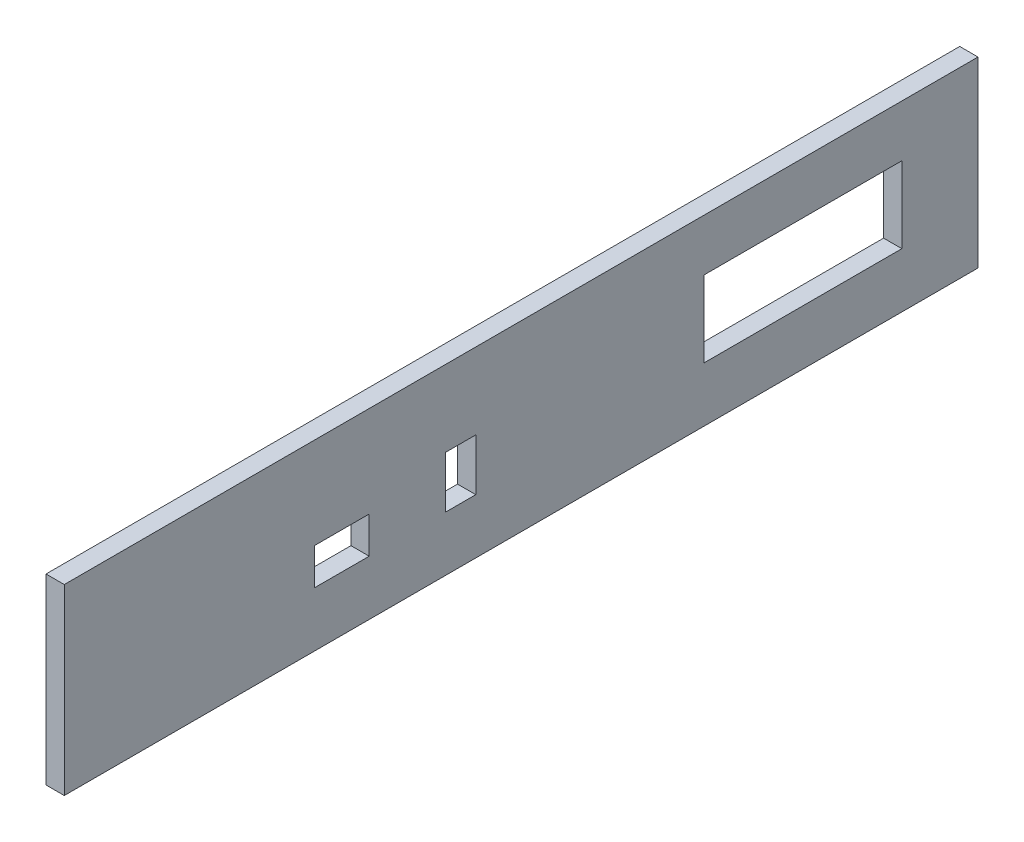
ISO-10303-21;
HEADER;
FILE_DESCRIPTION(('STEP AP214'),'2;1');
FILE_NAME('part.step','',(''),(''),'','','');
FILE_SCHEMA(('AUTOMOTIVE_DESIGN { 1 0 10303 214 1 1 1 1 }'));
ENDSEC;
DATA;
#1=APPLICATION_CONTEXT('core data for automotive mechanical design processes');
#2=APPLICATION_PROTOCOL_DEFINITION('international standard','automotive_design',2000,#1);
#3=PRODUCT_CONTEXT('',#1,'mechanical');
#4=PRODUCT('Part','Part','',(#3));
#5=PRODUCT_RELATED_PRODUCT_CATEGORY('part','',(#4));
#6=PRODUCT_DEFINITION_FORMATION('','',#4);
#7=PRODUCT_DEFINITION_CONTEXT('part definition',#1,'design');
#8=PRODUCT_DEFINITION('design','',#6,#7);
#9=PRODUCT_DEFINITION_SHAPE('','',#8);
#10=(LENGTH_UNIT() NAMED_UNIT(*) SI_UNIT(.MILLI.,.METRE.));
#11=(NAMED_UNIT(*) PLANE_ANGLE_UNIT() SI_UNIT($,.RADIAN.));
#12=(NAMED_UNIT(*) SI_UNIT($,.STERADIAN.) SOLID_ANGLE_UNIT());
#13=UNCERTAINTY_MEASURE_WITH_UNIT(LENGTH_MEASURE(1.E-05),#10,'distance_accuracy_value','');
#14=(GEOMETRIC_REPRESENTATION_CONTEXT(3) GLOBAL_UNCERTAINTY_ASSIGNED_CONTEXT((#13)) GLOBAL_UNIT_ASSIGNED_CONTEXT((#10,
#11,#12)) REPRESENTATION_CONTEXT('',''));
#15=CARTESIAN_POINT('',(0.,0.,0.));
#16=DIRECTION('',(0.,0.,1.));
#17=DIRECTION('',(1.,0.,0.));
#18=AXIS2_PLACEMENT_3D('',#15,#16,#17);
#19=CARTESIAN_POINT('',(6.,0.,0.));
#20=DIRECTION('',(1.,0.,0.));
#21=DIRECTION('',(0.,0.,-1.));
#22=AXIS2_PLACEMENT_3D('',#19,#20,#21);
#23=PLANE('',#22);
#24=DIRECTION('',(0.,-1.,0.));
#25=VECTOR('',#24,1.);
#26=CARTESIAN_POINT('',(6.,30.,150.));
#27=LINE('',#26,#25);
#28=CARTESIAN_POINT('',(6.,30.,150.));
#29=VERTEX_POINT('',#28);
#30=CARTESIAN_POINT('',(6.,-30.,150.));
#31=VERTEX_POINT('',#30);
#32=EDGE_CURVE('E243',#29,#31,#27,.T.);
#33=ORIENTED_EDGE('',*,*,#32,.T.);
#34=DIRECTION('',(0.,0.,-1.));
#35=VECTOR('',#34,1.);
#36=CARTESIAN_POINT('',(6.,-30.,150.));
#37=LINE('',#36,#35);
#38=CARTESIAN_POINT('',(6.,-30.,-150.));
#39=VERTEX_POINT('',#38);
#40=EDGE_CURVE('E246',#31,#39,#37,.T.);
#41=ORIENTED_EDGE('',*,*,#40,.T.);
#42=DIRECTION('',(0.,1.,0.));
#43=VECTOR('',#42,1.);
#44=CARTESIAN_POINT('',(6.,30.,-150.));
#45=LINE('',#44,#43);
#46=CARTESIAN_POINT('',(6.,30.,-150.));
#47=VERTEX_POINT('',#46);
#48=EDGE_CURVE('E249',#39,#47,#45,.T.);
#49=ORIENTED_EDGE('',*,*,#48,.T.);
#50=DIRECTION('',(0.,0.,1.));
#51=VECTOR('',#50,1.);
#52=CARTESIAN_POINT('',(6.,30.,150.));
#53=LINE('',#52,#51);
#54=EDGE_CURVE('E251',#47,#29,#53,.T.);
#55=ORIENTED_EDGE('',*,*,#54,.T.);
#56=EDGE_LOOP('',(#33,#41,#49,#55));
#57=FACE_BOUND('',#56,.T.);
#58=DIRECTION('',(0.,0.,1.));
#59=VECTOR('',#58,1.);
#60=CARTESIAN_POINT('',(6.,13.,-125.));
#61=LINE('',#60,#59);
#62=CARTESIAN_POINT('',(6.,13.,-125.));
#63=VERTEX_POINT('',#62);
#64=CARTESIAN_POINT('',(6.,13.,-60.));
#65=VERTEX_POINT('',#64);
#66=EDGE_CURVE('E214',#63,#65,#61,.T.);
#67=ORIENTED_EDGE('',*,*,#66,.F.);
#68=DIRECTION('',(0.,1.,0.));
#69=VECTOR('',#68,1.);
#70=CARTESIAN_POINT('',(6.,13.,-125.));
#71=LINE('',#70,#69);
#72=CARTESIAN_POINT('',(6.,-12.,-125.));
#73=VERTEX_POINT('',#72);
#74=EDGE_CURVE('E212',#73,#63,#71,.T.);
#75=ORIENTED_EDGE('',*,*,#74,.F.);
#76=DIRECTION('',(0.,0.,-1.));
#77=VECTOR('',#76,1.);
#78=CARTESIAN_POINT('',(6.,-12.,-125.));
#79=LINE('',#78,#77);
#80=CARTESIAN_POINT('',(6.,-12.,-60.));
#81=VERTEX_POINT('',#80);
#82=EDGE_CURVE('E220',#81,#73,#79,.T.);
#83=ORIENTED_EDGE('',*,*,#82,.F.);
#84=DIRECTION('',(0.,-1.,0.));
#85=VECTOR('',#84,1.);
#86=CARTESIAN_POINT('',(6.,13.,-60.));
#87=LINE('',#86,#85);
#88=EDGE_CURVE('E217',#65,#81,#87,.T.);
#89=ORIENTED_EDGE('',*,*,#88,.F.);
#90=EDGE_LOOP('',(#67,#75,#83,#89));
#91=FACE_BOUND('',#90,.T.);
#92=DIRECTION('',(0.,0.,1.));
#93=VECTOR('',#92,1.);
#94=CARTESIAN_POINT('',(6.,4.99999999999997,14.8850598135838));
#95=LINE('',#94,#93);
#96=CARTESIAN_POINT('',(6.,4.99999999999997,14.8850598135838));
#97=VERTEX_POINT('',#96);
#98=CARTESIAN_POINT('',(6.,4.99999999999997,24.8850598135838));
#99=VERTEX_POINT('',#98);
#100=EDGE_CURVE('E183',#97,#99,#95,.T.);
#101=ORIENTED_EDGE('',*,*,#100,.F.);
#102=DIRECTION('',(0.,1.,0.));
#103=VECTOR('',#102,1.);
#104=CARTESIAN_POINT('',(6.,4.99999999999997,14.8850598135838));
#105=LINE('',#104,#103);
#106=CARTESIAN_POINT('',(6.,-12.,14.8850598135838));
#107=VERTEX_POINT('',#106);
#108=EDGE_CURVE('E181',#107,#97,#105,.T.);
#109=ORIENTED_EDGE('',*,*,#108,.F.);
#110=DIRECTION('',(0.,0.,-1.));
#111=VECTOR('',#110,1.);
#112=CARTESIAN_POINT('',(6.,-12.,14.8850598135838));
#113=LINE('',#112,#111);
#114=CARTESIAN_POINT('',(6.,-12.,24.8850598135838));
#115=VERTEX_POINT('',#114);
#116=EDGE_CURVE('E189',#115,#107,#113,.T.);
#117=ORIENTED_EDGE('',*,*,#116,.F.);
#118=DIRECTION('',(0.,-1.,0.));
#119=VECTOR('',#118,1.);
#120=CARTESIAN_POINT('',(6.,4.99999999999997,24.8850598135838));
#121=LINE('',#120,#119);
#122=EDGE_CURVE('E186',#99,#115,#121,.T.);
#123=ORIENTED_EDGE('',*,*,#122,.F.);
#124=EDGE_LOOP('',(#101,#109,#117,#123));
#125=FACE_BOUND('',#124,.T.);
#126=DIRECTION('',(0.,0.,1.));
#127=VECTOR('',#126,1.);
#128=CARTESIAN_POINT('',(6.,0.,49.8850598135838));
#129=LINE('',#128,#127);
#130=CARTESIAN_POINT('',(6.,0.,49.8850598135838));
#131=VERTEX_POINT('',#130);
#132=CARTESIAN_POINT('',(6.,0.,67.8850598135838));
#133=VERTEX_POINT('',#132);
#134=EDGE_CURVE('E153',#131,#133,#129,.T.);
#135=ORIENTED_EDGE('',*,*,#134,.F.);
#136=DIRECTION('',(0.,1.,0.));
#137=VECTOR('',#136,1.);
#138=CARTESIAN_POINT('',(6.,0.,49.8850598135838));
#139=LINE('',#138,#137);
#140=CARTESIAN_POINT('',(6.,-12.,49.8850598135838));
#141=VERTEX_POINT('',#140);
#142=EDGE_CURVE('E145',#141,#131,#139,.T.);
#143=ORIENTED_EDGE('',*,*,#142,.F.);
#144=DIRECTION('',(0.,0.,-1.));
#145=VECTOR('',#144,1.);
#146=CARTESIAN_POINT('',(6.,-12.,49.8850598135838));
#147=LINE('',#146,#145);
#148=CARTESIAN_POINT('',(6.,-12.,67.8850598135838));
#149=VERTEX_POINT('',#148);
#150=EDGE_CURVE('E167',#149,#141,#147,.T.);
#151=ORIENTED_EDGE('',*,*,#150,.F.);
#152=DIRECTION('',(0.,-1.,0.));
#153=VECTOR('',#152,1.);
#154=CARTESIAN_POINT('',(6.,0.,67.8850598135838));
#155=LINE('',#154,#153);
#156=EDGE_CURVE('E165',#133,#149,#155,.T.);
#157=ORIENTED_EDGE('',*,*,#156,.F.);
#158=EDGE_LOOP('',(#135,#143,#151,#157));
#159=FACE_BOUND('',#158,.T.);
#160=ADVANCED_FACE('F32',(#57,#91,#125,#159),#23,.T.);
#161=CARTESIAN_POINT('',(0.,0.,0.));
#162=DIRECTION('',(1.,0.,0.));
#163=DIRECTION('',(0.,0.,-1.));
#164=AXIS2_PLACEMENT_3D('',#161,#162,#163);
#165=PLANE('',#164);
#166=DIRECTION('',(0.,1.,0.));
#167=VECTOR('',#166,1.);
#168=CARTESIAN_POINT('',(0.,4.99999999999997,14.8850598135838));
#169=LINE('',#168,#167);
#170=CARTESIAN_POINT('',(0.,-12.,14.8850598135838));
#171=VERTEX_POINT('',#170);
#172=CARTESIAN_POINT('',(0.,4.99999999999997,14.8850598135838));
#173=VERTEX_POINT('',#172);
#174=EDGE_CURVE('E161',#171,#173,#169,.T.);
#175=ORIENTED_EDGE('',*,*,#174,.T.);
#176=DIRECTION('',(0.,0.,1.));
#177=VECTOR('',#176,1.);
#178=CARTESIAN_POINT('',(0.,4.99999999999997,14.8850598135838));
#179=LINE('',#178,#177);
#180=CARTESIAN_POINT('',(0.,4.99999999999997,24.8850598135838));
#181=VERTEX_POINT('',#180);
#182=EDGE_CURVE('E194',#173,#181,#179,.T.);
#183=ORIENTED_EDGE('',*,*,#182,.T.);
#184=DIRECTION('',(0.,-1.,0.));
#185=VECTOR('',#184,1.);
#186=CARTESIAN_POINT('',(0.,4.99999999999997,24.8850598135838));
#187=LINE('',#186,#185);
#188=CARTESIAN_POINT('',(0.,-12.,24.8850598135838));
#189=VERTEX_POINT('',#188);
#190=EDGE_CURVE('E197',#181,#189,#187,.T.);
#191=ORIENTED_EDGE('',*,*,#190,.T.);
#192=DIRECTION('',(0.,0.,-1.));
#193=VECTOR('',#192,1.);
#194=CARTESIAN_POINT('',(0.,-12.,14.8850598135838));
#195=LINE('',#194,#193);
#196=EDGE_CURVE('E184',#189,#171,#195,.T.);
#197=ORIENTED_EDGE('',*,*,#196,.T.);
#198=EDGE_LOOP('',(#175,#183,#191,#197));
#199=FACE_BOUND('',#198,.T.);
#200=DIRECTION('',(0.,-1.,0.));
#201=VECTOR('',#200,1.);
#202=CARTESIAN_POINT('',(0.,30.,150.));
#203=LINE('',#202,#201);
#204=CARTESIAN_POINT('',(0.,30.,150.));
#205=VERTEX_POINT('',#204);
#206=CARTESIAN_POINT('',(0.,-30.,150.));
#207=VERTEX_POINT('',#206);
#208=EDGE_CURVE('E242',#205,#207,#203,.T.);
#209=ORIENTED_EDGE('',*,*,#208,.F.);
#210=DIRECTION('',(0.,0.,1.));
#211=VECTOR('',#210,1.);
#212=CARTESIAN_POINT('',(0.,30.,150.));
#213=LINE('',#212,#211);
#214=CARTESIAN_POINT('',(0.,30.,-150.));
#215=VERTEX_POINT('',#214);
#216=EDGE_CURVE('E247',#215,#205,#213,.T.);
#217=ORIENTED_EDGE('',*,*,#216,.F.);
#218=DIRECTION('',(0.,1.,0.));
#219=VECTOR('',#218,1.);
#220=CARTESIAN_POINT('',(0.,30.,-150.));
#221=LINE('',#220,#219);
#222=CARTESIAN_POINT('',(0.,-30.,-150.));
#223=VERTEX_POINT('',#222);
#224=EDGE_CURVE('E258',#223,#215,#221,.T.);
#225=ORIENTED_EDGE('',*,*,#224,.F.);
#226=DIRECTION('',(0.,0.,-1.));
#227=VECTOR('',#226,1.);
#228=CARTESIAN_POINT('',(0.,-30.,150.));
#229=LINE('',#228,#227);
#230=EDGE_CURVE('E256',#207,#223,#229,.T.);
#231=ORIENTED_EDGE('',*,*,#230,.F.);
#232=EDGE_LOOP('',(#209,#217,#225,#231));
#233=FACE_BOUND('',#232,.T.);
#234=DIRECTION('',(0.,1.,0.));
#235=VECTOR('',#234,1.);
#236=CARTESIAN_POINT('',(0.,13.,-125.));
#237=LINE('',#236,#235);
#238=CARTESIAN_POINT('',(0.,-12.,-125.));
#239=VERTEX_POINT('',#238);
#240=CARTESIAN_POINT('',(0.,13.,-125.));
#241=VERTEX_POINT('',#240);
#242=EDGE_CURVE('E211',#239,#241,#237,.T.);
#243=ORIENTED_EDGE('',*,*,#242,.T.);
#244=DIRECTION('',(0.,0.,1.));
#245=VECTOR('',#244,1.);
#246=CARTESIAN_POINT('',(0.,13.,-125.));
#247=LINE('',#246,#245);
#248=CARTESIAN_POINT('',(0.,13.,-60.));
#249=VERTEX_POINT('',#248);
#250=EDGE_CURVE('E225',#241,#249,#247,.T.);
#251=ORIENTED_EDGE('',*,*,#250,.T.);
#252=DIRECTION('',(0.,-1.,0.));
#253=VECTOR('',#252,1.);
#254=CARTESIAN_POINT('',(0.,13.,-60.));
#255=LINE('',#254,#253);
#256=CARTESIAN_POINT('',(0.,-12.,-60.));
#257=VERTEX_POINT('',#256);
#258=EDGE_CURVE('E228',#249,#257,#255,.T.);
#259=ORIENTED_EDGE('',*,*,#258,.T.);
#260=DIRECTION('',(0.,0.,-1.));
#261=VECTOR('',#260,1.);
#262=CARTESIAN_POINT('',(0.,-12.,-125.));
#263=LINE('',#262,#261);
#264=EDGE_CURVE('E215',#257,#239,#263,.T.);
#265=ORIENTED_EDGE('',*,*,#264,.T.);
#266=EDGE_LOOP('',(#243,#251,#259,#265));
#267=FACE_BOUND('',#266,.T.);
#268=DIRECTION('',(0.,1.,0.));
#269=VECTOR('',#268,1.);
#270=CARTESIAN_POINT('',(0.,0.,49.8850598135838));
#271=LINE('',#270,#269);
#272=CARTESIAN_POINT('',(0.,-12.,49.8850598135838));
#273=VERTEX_POINT('',#272);
#274=CARTESIAN_POINT('',(0.,0.,49.8850598135838));
#275=VERTEX_POINT('',#274);
#276=EDGE_CURVE('E55',#273,#275,#271,.T.);
#277=ORIENTED_EDGE('',*,*,#276,.T.);
#278=DIRECTION('',(0.,0.,1.));
#279=VECTOR('',#278,1.);
#280=CARTESIAN_POINT('',(0.,0.,49.8850598135838));
#281=LINE('',#280,#279);
#282=CARTESIAN_POINT('',(0.,0.,67.8850598135838));
#283=VERTEX_POINT('',#282);
#284=EDGE_CURVE('E160',#275,#283,#281,.T.);
#285=ORIENTED_EDGE('',*,*,#284,.T.);
#286=DIRECTION('',(0.,-1.,0.));
#287=VECTOR('',#286,1.);
#288=CARTESIAN_POINT('',(0.,0.,67.8850598135838));
#289=LINE('',#288,#287);
#290=CARTESIAN_POINT('',(0.,-12.,67.8850598135838));
#291=VERTEX_POINT('',#290);
#292=EDGE_CURVE('E173',#283,#291,#289,.T.);
#293=ORIENTED_EDGE('',*,*,#292,.T.);
#294=DIRECTION('',(0.,0.,-1.));
#295=VECTOR('',#294,1.);
#296=CARTESIAN_POINT('',(0.,-12.,49.8850598135838));
#297=LINE('',#296,#295);
#298=EDGE_CURVE('E154',#291,#273,#297,.T.);
#299=ORIENTED_EDGE('',*,*,#298,.T.);
#300=EDGE_LOOP('',(#277,#285,#293,#299));
#301=FACE_BOUND('',#300,.T.);
#302=ADVANCED_FACE('F276',(#199,#233,#267,#301),#165,.F.);
#303=CARTESIAN_POINT('',(6.,30.,150.));
#304=DIRECTION('',(0.,0.,-1.));
#305=DIRECTION('',(-1.,0.,0.));
#306=AXIS2_PLACEMENT_3D('',#303,#304,#305);
#307=PLANE('',#306);
#308=ORIENTED_EDGE('',*,*,#208,.T.);
#309=DIRECTION('',(-1.,0.,0.));
#310=VECTOR('',#309,1.);
#311=CARTESIAN_POINT('',(6.,-30.,150.));
#312=LINE('',#311,#310);
#313=EDGE_CURVE('E11',#31,#207,#312,.T.);
#314=ORIENTED_EDGE('',*,*,#313,.F.);
#315=ORIENTED_EDGE('',*,*,#32,.F.);
#316=DIRECTION('',(-1.,0.,0.));
#317=VECTOR('',#316,1.);
#318=CARTESIAN_POINT('',(6.,30.,150.));
#319=LINE('',#318,#317);
#320=EDGE_CURVE('E253',#29,#205,#319,.T.);
#321=ORIENTED_EDGE('',*,*,#320,.T.);
#322=EDGE_LOOP('',(#308,#314,#315,#321));
#323=FACE_BOUND('',#322,.T.);
#324=ADVANCED_FACE('F34',(#323),#307,.F.);
#325=CARTESIAN_POINT('',(6.,-30.,150.));
#326=DIRECTION('',(0.,1.,0.));
#327=DIRECTION('',(0.,0.,1.));
#328=AXIS2_PLACEMENT_3D('',#325,#326,#327);
#329=PLANE('',#328);
#330=ORIENTED_EDGE('',*,*,#230,.T.);
#331=DIRECTION('',(-1.,0.,0.));
#332=VECTOR('',#331,1.);
#333=CARTESIAN_POINT('',(6.,-30.,-150.));
#334=LINE('',#333,#332);
#335=EDGE_CURVE('E40',#39,#223,#334,.T.);
#336=ORIENTED_EDGE('',*,*,#335,.F.);
#337=ORIENTED_EDGE('',*,*,#40,.F.);
#338=ORIENTED_EDGE('',*,*,#313,.T.);
#339=EDGE_LOOP('',(#330,#336,#337,#338));
#340=FACE_BOUND('',#339,.T.);
#341=ADVANCED_FACE('F287',(#340),#329,.F.);
#342=CARTESIAN_POINT('',(6.,30.,-150.));
#343=DIRECTION('',(0.,0.,1.));
#344=DIRECTION('',(1.,0.,0.));
#345=AXIS2_PLACEMENT_3D('',#342,#343,#344);
#346=PLANE('',#345);
#347=ORIENTED_EDGE('',*,*,#224,.T.);
#348=DIRECTION('',(-1.,0.,0.));
#349=VECTOR('',#348,1.);
#350=CARTESIAN_POINT('',(6.,30.,-150.));
#351=LINE('',#350,#349);
#352=EDGE_CURVE('E263',#47,#215,#351,.T.);
#353=ORIENTED_EDGE('',*,*,#352,.F.);
#354=ORIENTED_EDGE('',*,*,#48,.F.);
#355=ORIENTED_EDGE('',*,*,#335,.T.);
#356=EDGE_LOOP('',(#347,#353,#354,#355));
#357=FACE_BOUND('',#356,.T.);
#358=ADVANCED_FACE('F270',(#357),#346,.F.);
#359=CARTESIAN_POINT('',(6.,30.,150.));
#360=DIRECTION('',(0.,-1.,0.));
#361=DIRECTION('',(0.,0.,-1.));
#362=AXIS2_PLACEMENT_3D('',#359,#360,#361);
#363=PLANE('',#362);
#364=ORIENTED_EDGE('',*,*,#216,.T.);
#365=ORIENTED_EDGE('',*,*,#320,.F.);
#366=ORIENTED_EDGE('',*,*,#54,.F.);
#367=ORIENTED_EDGE('',*,*,#352,.T.);
#368=EDGE_LOOP('',(#364,#365,#366,#367));
#369=FACE_BOUND('',#368,.T.);
#370=ADVANCED_FACE('F280',(#369),#363,.F.);
#371=CARTESIAN_POINT('',(6.,13.,-125.));
#372=DIRECTION('',(0.,0.,1.));
#373=DIRECTION('',(1.,0.,0.));
#374=AXIS2_PLACEMENT_3D('',#371,#372,#373);
#375=PLANE('',#374);
#376=ORIENTED_EDGE('',*,*,#242,.F.);
#377=DIRECTION('',(-1.,0.,0.));
#378=VECTOR('',#377,1.);
#379=CARTESIAN_POINT('',(6.,-12.,-125.));
#380=LINE('',#379,#378);
#381=EDGE_CURVE('E222',#73,#239,#380,.T.);
#382=ORIENTED_EDGE('',*,*,#381,.F.);
#383=ORIENTED_EDGE('',*,*,#74,.T.);
#384=DIRECTION('',(-1.,0.,0.));
#385=VECTOR('',#384,1.);
#386=CARTESIAN_POINT('',(6.,13.,-125.));
#387=LINE('',#386,#385);
#388=EDGE_CURVE('E239',#63,#241,#387,.T.);
#389=ORIENTED_EDGE('',*,*,#388,.T.);
#390=EDGE_LOOP('',(#376,#382,#383,#389));
#391=FACE_BOUND('',#390,.T.);
#392=ADVANCED_FACE('F302',(#391),#375,.T.);
#393=CARTESIAN_POINT('',(6.,13.,-125.));
#394=DIRECTION('',(0.,-1.,0.));
#395=DIRECTION('',(0.,0.,-1.));
#396=AXIS2_PLACEMENT_3D('',#393,#394,#395);
#397=PLANE('',#396);
#398=ORIENTED_EDGE('',*,*,#250,.F.);
#399=ORIENTED_EDGE('',*,*,#388,.F.);
#400=ORIENTED_EDGE('',*,*,#66,.T.);
#401=DIRECTION('',(-1.,0.,0.));
#402=VECTOR('',#401,1.);
#403=CARTESIAN_POINT('',(6.,13.,-60.));
#404=LINE('',#403,#402);
#405=EDGE_CURVE('E237',#65,#249,#404,.T.);
#406=ORIENTED_EDGE('',*,*,#405,.T.);
#407=EDGE_LOOP('',(#398,#399,#400,#406));
#408=FACE_BOUND('',#407,.T.);
#409=ADVANCED_FACE('F309',(#408),#397,.T.);
#410=CARTESIAN_POINT('',(6.,13.,-60.));
#411=DIRECTION('',(0.,0.,-1.));
#412=DIRECTION('',(-1.,0.,0.));
#413=AXIS2_PLACEMENT_3D('',#410,#411,#412);
#414=PLANE('',#413);
#415=ORIENTED_EDGE('',*,*,#258,.F.);
#416=ORIENTED_EDGE('',*,*,#405,.F.);
#417=ORIENTED_EDGE('',*,*,#88,.T.);
#418=DIRECTION('',(-1.,0.,0.));
#419=VECTOR('',#418,1.);
#420=CARTESIAN_POINT('',(6.,-12.,-60.));
#421=LINE('',#420,#419);
#422=EDGE_CURVE('E235',#81,#257,#421,.T.);
#423=ORIENTED_EDGE('',*,*,#422,.T.);
#424=EDGE_LOOP('',(#415,#416,#417,#423));
#425=FACE_BOUND('',#424,.T.);
#426=ADVANCED_FACE('F314',(#425),#414,.T.);
#427=CARTESIAN_POINT('',(6.,-12.,-125.));
#428=DIRECTION('',(0.,1.,0.));
#429=DIRECTION('',(0.,0.,1.));
#430=AXIS2_PLACEMENT_3D('',#427,#428,#429);
#431=PLANE('',#430);
#432=ORIENTED_EDGE('',*,*,#264,.F.);
#433=ORIENTED_EDGE('',*,*,#422,.F.);
#434=ORIENTED_EDGE('',*,*,#82,.T.);
#435=ORIENTED_EDGE('',*,*,#381,.T.);
#436=EDGE_LOOP('',(#432,#433,#434,#435));
#437=FACE_BOUND('',#436,.T.);
#438=ADVANCED_FACE('F321',(#437),#431,.T.);
#439=CARTESIAN_POINT('',(6.,4.99999999999997,14.8850598135838));
#440=DIRECTION('',(0.,0.,1.));
#441=DIRECTION('',(1.,0.,0.));
#442=AXIS2_PLACEMENT_3D('',#439,#440,#441);
#443=PLANE('',#442);
#444=ORIENTED_EDGE('',*,*,#174,.F.);
#445=DIRECTION('',(-1.,0.,0.));
#446=VECTOR('',#445,1.);
#447=CARTESIAN_POINT('',(6.,-12.,14.8850598135838));
#448=LINE('',#447,#446);
#449=EDGE_CURVE('E191',#107,#171,#448,.T.);
#450=ORIENTED_EDGE('',*,*,#449,.F.);
#451=ORIENTED_EDGE('',*,*,#108,.T.);
#452=DIRECTION('',(-1.,0.,0.));
#453=VECTOR('',#452,1.);
#454=CARTESIAN_POINT('',(6.,4.99999999999997,14.8850598135838));
#455=LINE('',#454,#453);
#456=EDGE_CURVE('E208',#97,#173,#455,.T.);
#457=ORIENTED_EDGE('',*,*,#456,.T.);
#458=EDGE_LOOP('',(#444,#450,#451,#457));
#459=FACE_BOUND('',#458,.T.);
#460=ADVANCED_FACE('F343',(#459),#443,.T.);
#461=CARTESIAN_POINT('',(6.,4.99999999999997,14.8850598135838));
#462=DIRECTION('',(0.,-1.,0.));
#463=DIRECTION('',(0.,0.,-1.));
#464=AXIS2_PLACEMENT_3D('',#461,#462,#463);
#465=PLANE('',#464);
#466=ORIENTED_EDGE('',*,*,#182,.F.);
#467=ORIENTED_EDGE('',*,*,#456,.F.);
#468=ORIENTED_EDGE('',*,*,#100,.T.);
#469=DIRECTION('',(-1.,0.,0.));
#470=VECTOR('',#469,1.);
#471=CARTESIAN_POINT('',(6.,4.99999999999997,24.8850598135838));
#472=LINE('',#471,#470);
#473=EDGE_CURVE('E206',#99,#181,#472,.T.);
#474=ORIENTED_EDGE('',*,*,#473,.T.);
#475=EDGE_LOOP('',(#466,#467,#468,#474));
#476=FACE_BOUND('',#475,.T.);
#477=ADVANCED_FACE('F337',(#476),#465,.T.);
#478=CARTESIAN_POINT('',(6.,4.99999999999997,24.8850598135838));
#479=DIRECTION('',(0.,0.,-1.));
#480=DIRECTION('',(-1.,0.,0.));
#481=AXIS2_PLACEMENT_3D('',#478,#479,#480);
#482=PLANE('',#481);
#483=ORIENTED_EDGE('',*,*,#190,.F.);
#484=ORIENTED_EDGE('',*,*,#473,.F.);
#485=ORIENTED_EDGE('',*,*,#122,.T.);
#486=DIRECTION('',(-1.,0.,0.));
#487=VECTOR('',#486,1.);
#488=CARTESIAN_POINT('',(6.,-12.,24.8850598135838));
#489=LINE('',#488,#487);
#490=EDGE_CURVE('E204',#115,#189,#489,.T.);
#491=ORIENTED_EDGE('',*,*,#490,.T.);
#492=EDGE_LOOP('',(#483,#484,#485,#491));
#493=FACE_BOUND('',#492,.T.);
#494=ADVANCED_FACE('F340',(#493),#482,.T.);
#495=CARTESIAN_POINT('',(6.,-12.,14.8850598135838));
#496=DIRECTION('',(0.,1.,0.));
#497=DIRECTION('',(0.,0.,1.));
#498=AXIS2_PLACEMENT_3D('',#495,#496,#497);
#499=PLANE('',#498);
#500=ORIENTED_EDGE('',*,*,#196,.F.);
#501=ORIENTED_EDGE('',*,*,#490,.F.);
#502=ORIENTED_EDGE('',*,*,#116,.T.);
#503=ORIENTED_EDGE('',*,*,#449,.T.);
#504=EDGE_LOOP('',(#500,#501,#502,#503));
#505=FACE_BOUND('',#504,.T.);
#506=ADVANCED_FACE('F346',(#505),#499,.T.);
#507=CARTESIAN_POINT('',(6.,0.,49.8850598135838));
#508=DIRECTION('',(0.,0.,1.));
#509=DIRECTION('',(1.,0.,0.));
#510=AXIS2_PLACEMENT_3D('',#507,#508,#509);
#511=PLANE('',#510);
#512=ORIENTED_EDGE('',*,*,#276,.F.);
#513=DIRECTION('',(-1.,0.,0.));
#514=VECTOR('',#513,1.);
#515=CARTESIAN_POINT('',(6.,-12.,49.8850598135838));
#516=LINE('',#515,#514);
#517=EDGE_CURVE('E149',#141,#273,#516,.T.);
#518=ORIENTED_EDGE('',*,*,#517,.F.);
#519=ORIENTED_EDGE('',*,*,#142,.T.);
#520=DIRECTION('',(-1.,0.,0.));
#521=VECTOR('',#520,1.);
#522=CARTESIAN_POINT('',(6.,0.,49.8850598135838));
#523=LINE('',#522,#521);
#524=EDGE_CURVE('E148',#131,#275,#523,.T.);
#525=ORIENTED_EDGE('',*,*,#524,.T.);
#526=EDGE_LOOP('',(#512,#518,#519,#525));
#527=FACE_BOUND('',#526,.T.);
#528=ADVANCED_FACE('F147',(#527),#511,.T.);
#529=CARTESIAN_POINT('',(6.,0.,49.8850598135838));
#530=DIRECTION('',(0.,-1.,0.));
#531=DIRECTION('',(0.,0.,-1.));
#532=AXIS2_PLACEMENT_3D('',#529,#530,#531);
#533=PLANE('',#532);
#534=ORIENTED_EDGE('',*,*,#284,.F.);
#535=ORIENTED_EDGE('',*,*,#524,.F.);
#536=ORIENTED_EDGE('',*,*,#134,.T.);
#537=DIRECTION('',(-1.,0.,0.));
#538=VECTOR('',#537,1.);
#539=CARTESIAN_POINT('',(6.,0.,67.8850598135838));
#540=LINE('',#539,#538);
#541=EDGE_CURVE('E162',#133,#283,#540,.T.);
#542=ORIENTED_EDGE('',*,*,#541,.T.);
#543=EDGE_LOOP('',(#534,#535,#536,#542));
#544=FACE_BOUND('',#543,.T.);
#545=ADVANCED_FACE('F157',(#544),#533,.T.);
#546=CARTESIAN_POINT('',(6.,0.,67.8850598135838));
#547=DIRECTION('',(0.,0.,-1.));
#548=DIRECTION('',(-1.,0.,0.));
#549=AXIS2_PLACEMENT_3D('',#546,#547,#548);
#550=PLANE('',#549);
#551=ORIENTED_EDGE('',*,*,#292,.F.);
#552=ORIENTED_EDGE('',*,*,#541,.F.);
#553=ORIENTED_EDGE('',*,*,#156,.T.);
#554=DIRECTION('',(-1.,0.,0.));
#555=VECTOR('',#554,1.);
#556=CARTESIAN_POINT('',(6.,-12.,67.8850598135838));
#557=LINE('',#556,#555);
#558=EDGE_CURVE('E47',#149,#291,#557,.T.);
#559=ORIENTED_EDGE('',*,*,#558,.T.);
#560=EDGE_LOOP('',(#551,#552,#553,#559));
#561=FACE_BOUND('',#560,.T.);
#562=ADVANCED_FACE('F403',(#561),#550,.T.);
#563=CARTESIAN_POINT('',(6.,-12.,49.8850598135838));
#564=DIRECTION('',(0.,1.,0.));
#565=DIRECTION('',(0.,0.,1.));
#566=AXIS2_PLACEMENT_3D('',#563,#564,#565);
#567=PLANE('',#566);
#568=ORIENTED_EDGE('',*,*,#298,.F.);
#569=ORIENTED_EDGE('',*,*,#558,.F.);
#570=ORIENTED_EDGE('',*,*,#150,.T.);
#571=ORIENTED_EDGE('',*,*,#517,.T.);
#572=EDGE_LOOP('',(#568,#569,#570,#571));
#573=FACE_BOUND('',#572,.T.);
#574=ADVANCED_FACE('F411',(#573),#567,.T.);
#575=CLOSED_SHELL('',(#160,#302,#324,#341,#358,#370,#392,#409,#426,#438,#460,#477,#494,#506,
#528,#545,#562,#574));
#576=MANIFOLD_SOLID_BREP('B2',#575);
#577=ADVANCED_BREP_SHAPE_REPRESENTATION('',(#18,#576),#14);
#578=SHAPE_DEFINITION_REPRESENTATION(#9,#577);
ENDSEC;
END-ISO-10303-21;
